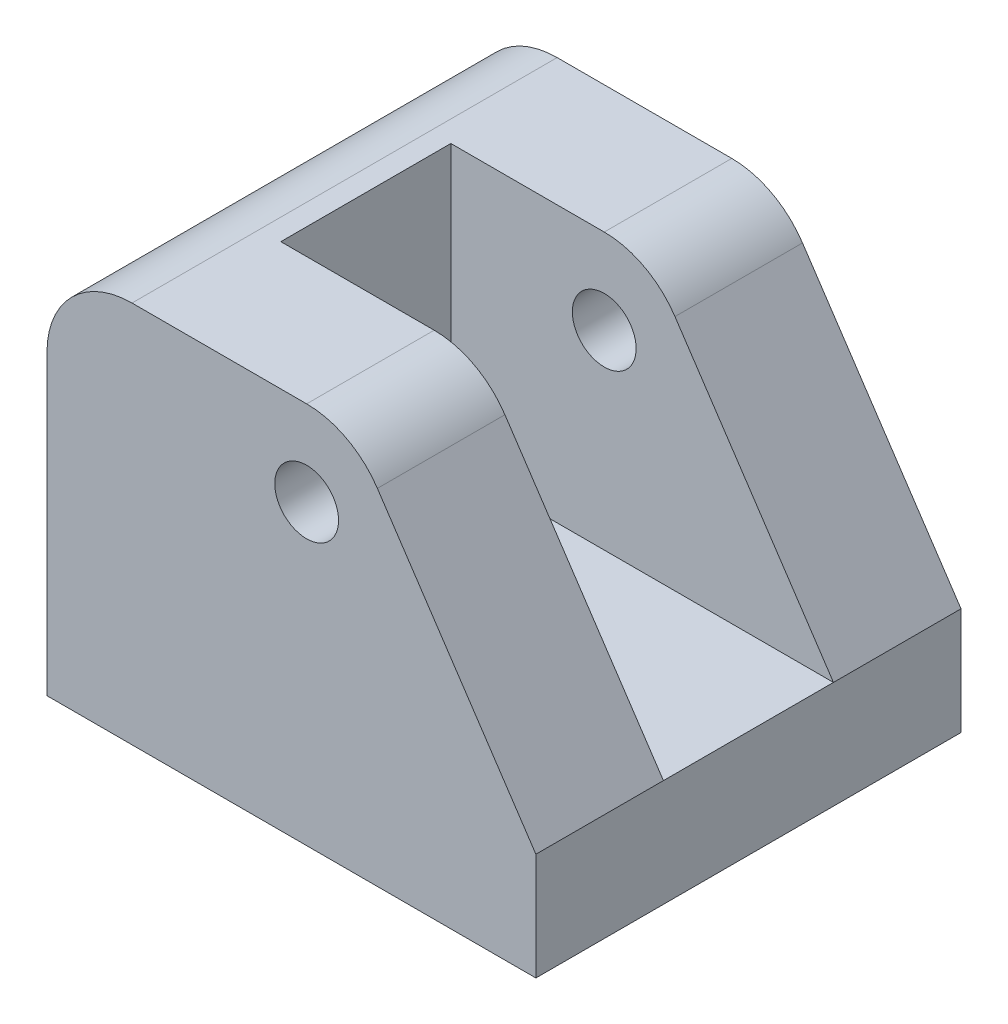
ISO-10303-21;
HEADER;
FILE_DESCRIPTION(('STEP AP214'),'2;1');
FILE_NAME('part.step','',(''),(''),'','','');
FILE_SCHEMA(('AUTOMOTIVE_DESIGN { 1 0 10303 214 1 1 1 1 }'));
ENDSEC;
DATA;
#1=APPLICATION_CONTEXT('core data for automotive mechanical design processes');
#2=APPLICATION_PROTOCOL_DEFINITION('international standard','automotive_design',2000,#1);
#3=PRODUCT_CONTEXT('',#1,'mechanical');
#4=PRODUCT('Part','Part','',(#3));
#5=PRODUCT_RELATED_PRODUCT_CATEGORY('part','',(#4));
#6=PRODUCT_DEFINITION_FORMATION('','',#4);
#7=PRODUCT_DEFINITION_CONTEXT('part definition',#1,'design');
#8=PRODUCT_DEFINITION('design','',#6,#7);
#9=PRODUCT_DEFINITION_SHAPE('','',#8);
#10=(LENGTH_UNIT() NAMED_UNIT(*) SI_UNIT(.MILLI.,.METRE.));
#11=(NAMED_UNIT(*) PLANE_ANGLE_UNIT() SI_UNIT($,.RADIAN.));
#12=(NAMED_UNIT(*) SI_UNIT($,.STERADIAN.) SOLID_ANGLE_UNIT());
#13=UNCERTAINTY_MEASURE_WITH_UNIT(LENGTH_MEASURE(1.E-05),#10,'distance_accuracy_value','');
#14=(GEOMETRIC_REPRESENTATION_CONTEXT(3) GLOBAL_UNCERTAINTY_ASSIGNED_CONTEXT((#13)) GLOBAL_UNIT_ASSIGNED_CONTEXT((#10,
#11,#12)) REPRESENTATION_CONTEXT('',''));
#15=CARTESIAN_POINT('',(0.,0.,0.));
#16=DIRECTION('',(0.,0.,1.));
#17=DIRECTION('',(1.,0.,0.));
#18=AXIS2_PLACEMENT_3D('',#15,#16,#17);
#19=CARTESIAN_POINT('',(100.422581046956,180.,-36.791008543361));
#20=DIRECTION('',(-0.831873688632426,-0.554965013456778,0.));
#21=DIRECTION('',(0.554965013456778,-0.831873688632426,0.));
#22=AXIS2_PLACEMENT_3D('',#19,#20,#21);
#23=PLANE('',#22);
#24=DIRECTION('',(0.,0.,1.));
#25=VECTOR('',#24,1.);
#26=CARTESIAN_POINT('',(186.865714121577,50.4246822339033,-36.791008543361));
#27=LINE('',#26,#25);
#28=CARTESIAN_POINT('',(186.865714121577,50.4246822339033,103.208991456639));
#29=VERTEX_POINT('',#28);
#30=CARTESIAN_POINT('',(186.865714121577,50.4246822339033,163.208991456639));
#31=VERTEX_POINT('',#30);
#32=EDGE_CURVE('E171',#29,#31,#27,.T.);
#33=ORIENTED_EDGE('',*,*,#32,.F.);
#34=DIRECTION('',(-0.554965013456778,0.831873688632426,0.));
#35=VECTOR('',#34,1.);
#36=CARTESIAN_POINT('',(100.422581046956,180.,103.208991456639));
#37=LINE('',#36,#35);
#38=CARTESIAN_POINT('',(112.298367030846,162.198600538271,103.208991456639));
#39=VERTEX_POINT('',#38);
#40=EDGE_CURVE('E127',#29,#39,#37,.T.);
#41=ORIENTED_EDGE('',*,*,#40,.T.);
#42=DIRECTION('',(0.,0.,1.));
#43=VECTOR('',#42,1.);
#44=CARTESIAN_POINT('',(112.298367030846,162.198600538271,-36.791008543361));
#45=LINE('',#44,#43);
#46=CARTESIAN_POINT('',(112.298367030846,162.198600538271,163.208991456639));
#47=VERTEX_POINT('',#46);
#48=EDGE_CURVE('E203',#39,#47,#45,.T.);
#49=ORIENTED_EDGE('',*,*,#48,.T.);
#50=DIRECTION('',(0.554965013456778,-0.831873688632426,0.));
#51=VECTOR('',#50,1.);
#52=CARTESIAN_POINT('',(100.422581046956,180.,163.208991456639));
#53=LINE('',#52,#51);
#54=EDGE_CURVE('E166',#47,#31,#53,.T.);
#55=ORIENTED_EDGE('',*,*,#54,.T.);
#56=EDGE_LOOP('',(#33,#41,#49,#55));
#57=FACE_BOUND('',#56,.T.);
#58=ADVANCED_FACE('F31',(#57),#23,.F.);
#59=CARTESIAN_POINT('',(79.0234194855493,140.,-36.791008543361));
#60=DIRECTION('',(0.,0.,1.));
#61=DIRECTION('',(1.,0.,0.));
#62=AXIS2_PLACEMENT_3D('',#59,#60,#61);
#63=CYLINDRICAL_SURFACE('',#62,40.);
#64=CARTESIAN_POINT('',(79.0234194855493,140.,103.208991456639));
#65=DIRECTION('',(0.,0.,1.));
#66=DIRECTION('',(1.,0.,0.));
#67=AXIS2_PLACEMENT_3D('',#64,#65,#66);
#68=CIRCLE('',#67,40.);
#69=CARTESIAN_POINT('',(79.0234194855493,180.,103.208991456639));
#70=VERTEX_POINT('',#69);
#71=EDGE_CURVE('E11',#70,#39,#68,.F.);
#72=ORIENTED_EDGE('',*,*,#71,.F.);
#73=DIRECTION('',(0.,0.,1.));
#74=VECTOR('',#73,1.);
#75=CARTESIAN_POINT('',(79.0234194855493,180.,-36.7910085433611));
#76=LINE('',#75,#74);
#77=CARTESIAN_POINT('',(79.0234194855493,180.,163.208991456639));
#78=VERTEX_POINT('',#77);
#79=EDGE_CURVE('E215',#78,#70,#76,.F.);
#80=ORIENTED_EDGE('',*,*,#79,.F.);
#81=CARTESIAN_POINT('',(79.0234194855493,140.,163.208991456639));
#82=DIRECTION('',(0.,0.,-1.));
#83=DIRECTION('',(-1.,0.,0.));
#84=AXIS2_PLACEMENT_3D('',#81,#82,#83);
#85=CIRCLE('',#84,40.);
#86=EDGE_CURVE('E209',#47,#78,#85,.F.);
#87=ORIENTED_EDGE('',*,*,#86,.F.);
#88=ORIENTED_EDGE('',*,*,#48,.F.);
#89=EDGE_LOOP('',(#72,#80,#87,#88));
#90=FACE_BOUND('',#89,.T.);
#91=ADVANCED_FACE('F262',(#90),#63,.T.);
#92=CARTESIAN_POINT('',(-43.1342858784233,180.,163.208991456639));
#93=DIRECTION('',(1.,0.,0.));
#94=DIRECTION('',(0.,0.,-1.));
#95=AXIS2_PLACEMENT_3D('',#92,#93,#94);
#96=PLANE('',#95);
#97=DIRECTION('',(0.,-1.,0.));
#98=VECTOR('',#97,1.);
#99=CARTESIAN_POINT('',(-43.1342858784233,180.,163.208991456639));
#100=LINE('',#99,#98);
#101=CARTESIAN_POINT('',(-43.1342858784233,140.,163.208991456639));
#102=VERTEX_POINT('',#101);
#103=CARTESIAN_POINT('',(-43.1342858784233,0.,163.208991456639));
#104=VERTEX_POINT('',#103);
#105=EDGE_CURVE('E201',#102,#104,#100,.T.);
#106=ORIENTED_EDGE('',*,*,#105,.F.);
#107=DIRECTION('',(0.,0.,1.));
#108=VECTOR('',#107,1.);
#109=CARTESIAN_POINT('',(-43.1342858784233,140.,163.208991456639));
#110=LINE('',#109,#108);
#111=CARTESIAN_POINT('',(-43.1342858784233,140.,-36.7910085433611));
#112=VERTEX_POINT('',#111);
#113=EDGE_CURVE('E55',#102,#112,#110,.F.);
#114=ORIENTED_EDGE('',*,*,#113,.T.);
#115=DIRECTION('',(0.,-1.,0.));
#116=VECTOR('',#115,1.);
#117=CARTESIAN_POINT('',(-43.1342858784233,180.,-36.7910085433611));
#118=LINE('',#117,#116);
#119=CARTESIAN_POINT('',(-43.1342858784233,0.,-36.7910085433611));
#120=VERTEX_POINT('',#119);
#121=EDGE_CURVE('E185',#112,#120,#118,.T.);
#122=ORIENTED_EDGE('',*,*,#121,.T.);
#123=DIRECTION('',(0.,0.,1.));
#124=VECTOR('',#123,1.);
#125=CARTESIAN_POINT('',(-43.1342858784233,0.,163.208991456639));
#126=LINE('',#125,#124);
#127=EDGE_CURVE('E177',#120,#104,#126,.T.);
#128=ORIENTED_EDGE('',*,*,#127,.T.);
#129=EDGE_LOOP('',(#106,#114,#122,#128));
#130=FACE_BOUND('',#129,.T.);
#131=ADVANCED_FACE('F249',(#130),#96,.F.);
#132=CARTESIAN_POINT('',(-43.1342858784233,180.,163.208991456639));
#133=DIRECTION('',(0.,0.,-1.));
#134=DIRECTION('',(-1.,0.,0.));
#135=AXIS2_PLACEMENT_3D('',#132,#133,#134);
#136=PLANE('',#135);
#137=CARTESIAN_POINT('',(79.0234194855493,140.,163.208991456639));
#138=DIRECTION('',(0.,0.,1.));
#139=DIRECTION('',(1.,0.,0.));
#140=AXIS2_PLACEMENT_3D('',#137,#138,#139);
#141=CIRCLE('',#140,15.);
#142=CARTESIAN_POINT('',(94.0234194855493,140.,163.208991456639));
#143=VERTEX_POINT('',#142);
#144=EDGE_CURVE('E427',#143,#143,#141,.T.);
#145=ORIENTED_EDGE('',*,*,#144,.F.);
#146=EDGE_LOOP('',(#145));
#147=FACE_BOUND('',#146,.T.);
#148=ORIENTED_EDGE('',*,*,#54,.F.);
#149=ORIENTED_EDGE('',*,*,#86,.T.);
#150=DIRECTION('',(1.,0.,0.));
#151=VECTOR('',#150,1.);
#152=CARTESIAN_POINT('',(-43.1342858784233,180.,163.208991456639));
#153=LINE('',#152,#151);
#154=CARTESIAN_POINT('',(-3.13428587842333,180.,163.208991456639));
#155=VERTEX_POINT('',#154);
#156=EDGE_CURVE('E178',#155,#78,#153,.T.);
#157=ORIENTED_EDGE('',*,*,#156,.F.);
#158=CARTESIAN_POINT('',(-3.13428587842333,140.,163.208991456639));
#159=DIRECTION('',(0.,0.,-1.));
#160=DIRECTION('',(-1.,0.,0.));
#161=AXIS2_PLACEMENT_3D('',#158,#159,#160);
#162=CIRCLE('',#161,40.);
#163=EDGE_CURVE('E207',#155,#102,#162,.F.);
#164=ORIENTED_EDGE('',*,*,#163,.T.);
#165=ORIENTED_EDGE('',*,*,#105,.T.);
#166=DIRECTION('',(1.,0.,0.));
#167=VECTOR('',#166,1.);
#168=CARTESIAN_POINT('',(-43.1342858784233,0.,163.208991456639));
#169=LINE('',#168,#167);
#170=CARTESIAN_POINT('',(186.865714121577,0.,163.208991456639));
#171=VERTEX_POINT('',#170);
#172=EDGE_CURVE('E188',#104,#171,#169,.T.);
#173=ORIENTED_EDGE('',*,*,#172,.T.);
#174=DIRECTION('',(0.,-1.,0.));
#175=VECTOR('',#174,1.);
#176=CARTESIAN_POINT('',(186.865714121577,180.,163.208991456639));
#177=LINE('',#176,#175);
#178=EDGE_CURVE('E199',#31,#171,#177,.T.);
#179=ORIENTED_EDGE('',*,*,#178,.F.);
#180=EDGE_LOOP('',(#148,#149,#157,#164,#165,#173,#179));
#181=FACE_BOUND('',#180,.T.);
#182=ADVANCED_FACE('F256',(#147,#181),#136,.F.);
#183=CARTESIAN_POINT('',(186.865714121577,180.,163.208991456639));
#184=DIRECTION('',(-1.,0.,0.));
#185=DIRECTION('',(0.,0.,1.));
#186=AXIS2_PLACEMENT_3D('',#183,#184,#185);
#187=PLANE('',#186);
#188=DIRECTION('',(0.,-1.,0.));
#189=VECTOR('',#188,1.);
#190=CARTESIAN_POINT('',(186.865714121577,180.,-36.7910085433611));
#191=LINE('',#190,#189);
#192=CARTESIAN_POINT('',(186.865714121577,50.4246822339033,-36.791008543361));
#193=VERTEX_POINT('',#192);
#194=CARTESIAN_POINT('',(186.865714121577,0.,-36.7910085433611));
#195=VERTEX_POINT('',#194);
#196=EDGE_CURVE('E197',#193,#195,#191,.T.);
#197=ORIENTED_EDGE('',*,*,#196,.F.);
#198=CARTESIAN_POINT('',(186.865714121577,50.4246822339033,23.208991456639));
#199=VERTEX_POINT('',#198);
#200=EDGE_CURVE('E174',#193,#199,#27,.T.);
#201=ORIENTED_EDGE('',*,*,#200,.T.);
#202=DIRECTION('',(0.,0.,-1.));
#203=VECTOR('',#202,1.);
#204=CARTESIAN_POINT('',(186.865714121577,50.4246822339033,103.208991456639));
#205=LINE('',#204,#203);
#206=EDGE_CURVE('E145',#29,#199,#205,.T.);
#207=ORIENTED_EDGE('',*,*,#206,.F.);
#208=ORIENTED_EDGE('',*,*,#32,.T.);
#209=ORIENTED_EDGE('',*,*,#178,.T.);
#210=DIRECTION('',(0.,0.,-1.));
#211=VECTOR('',#210,1.);
#212=CARTESIAN_POINT('',(186.865714121577,0.,163.208991456639));
#213=LINE('',#212,#211);
#214=EDGE_CURVE('E191',#171,#195,#213,.T.);
#215=ORIENTED_EDGE('',*,*,#214,.T.);
#216=EDGE_LOOP('',(#197,#201,#207,#208,#209,#215));
#217=FACE_BOUND('',#216,.T.);
#218=ADVANCED_FACE('F241',(#217),#187,.F.);
#219=CARTESIAN_POINT('',(-43.1342858784233,180.,-36.7910085433611));
#220=DIRECTION('',(0.,0.,1.));
#221=DIRECTION('',(1.,0.,0.));
#222=AXIS2_PLACEMENT_3D('',#219,#220,#221);
#223=PLANE('',#222);
#224=CARTESIAN_POINT('',(79.0234194855493,140.,-36.791008543361));
#225=DIRECTION('',(0.,0.,1.));
#226=DIRECTION('',(1.,0.,0.));
#227=AXIS2_PLACEMENT_3D('',#224,#225,#226);
#228=CIRCLE('',#227,15.);
#229=CARTESIAN_POINT('',(94.0234194855493,140.,-36.791008543361));
#230=VERTEX_POINT('',#229);
#231=EDGE_CURVE('E424',#230,#230,#228,.T.);
#232=ORIENTED_EDGE('',*,*,#231,.T.);
#233=EDGE_LOOP('',(#232));
#234=FACE_BOUND('',#233,.T.);
#235=DIRECTION('',(-1.,0.,0.));
#236=VECTOR('',#235,1.);
#237=CARTESIAN_POINT('',(-43.1342858784233,180.,-36.7910085433611));
#238=LINE('',#237,#236);
#239=CARTESIAN_POINT('',(79.0234194855493,180.,-36.7910085433611));
#240=VERTEX_POINT('',#239);
#241=CARTESIAN_POINT('',(-3.13428587842333,180.,-36.7910085433611));
#242=VERTEX_POINT('',#241);
#243=EDGE_CURVE('E181',#240,#242,#238,.T.);
#244=ORIENTED_EDGE('',*,*,#243,.F.);
#245=CARTESIAN_POINT('',(79.0234194855493,140.,-36.7910085433611));
#246=DIRECTION('',(0.,0.,1.));
#247=DIRECTION('',(1.,0.,0.));
#248=AXIS2_PLACEMENT_3D('',#245,#246,#247);
#249=CIRCLE('',#248,40.);
#250=CARTESIAN_POINT('',(112.298367030846,162.198600538271,-36.791008543361));
#251=VERTEX_POINT('',#250);
#252=EDGE_CURVE('E220',#240,#251,#249,.F.);
#253=ORIENTED_EDGE('',*,*,#252,.T.);
#254=DIRECTION('',(0.554965013456778,-0.831873688632426,0.));
#255=VECTOR('',#254,1.);
#256=CARTESIAN_POINT('',(100.422581046956,180.,-36.791008543361));
#257=LINE('',#256,#255);
#258=EDGE_CURVE('E169',#251,#193,#257,.T.);
#259=ORIENTED_EDGE('',*,*,#258,.T.);
#260=ORIENTED_EDGE('',*,*,#196,.T.);
#261=DIRECTION('',(-1.,0.,0.));
#262=VECTOR('',#261,1.);
#263=CARTESIAN_POINT('',(-43.1342858784233,0.,-36.7910085433611));
#264=LINE('',#263,#262);
#265=EDGE_CURVE('E182',#195,#120,#264,.T.);
#266=ORIENTED_EDGE('',*,*,#265,.T.);
#267=ORIENTED_EDGE('',*,*,#121,.F.);
#268=CARTESIAN_POINT('',(-3.13428587842333,140.,-36.7910085433611));
#269=DIRECTION('',(0.,0.,1.));
#270=DIRECTION('',(1.,0.,0.));
#271=AXIS2_PLACEMENT_3D('',#268,#269,#270);
#272=CIRCLE('',#271,40.);
#273=EDGE_CURVE('E218',#112,#242,#272,.F.);
#274=ORIENTED_EDGE('',*,*,#273,.T.);
#275=EDGE_LOOP('',(#244,#253,#259,#260,#266,#267,#274));
#276=FACE_BOUND('',#275,.T.);
#277=ADVANCED_FACE('F234',(#234,#276),#223,.F.);
#278=CARTESIAN_POINT('',(-43.1342858784233,180.,-36.7910085433611));
#279=DIRECTION('',(0.,-1.,0.));
#280=DIRECTION('',(0.,0.,-1.));
#281=AXIS2_PLACEMENT_3D('',#278,#279,#280);
#282=PLANE('',#281);
#283=ORIENTED_EDGE('',*,*,#79,.T.);
#284=DIRECTION('',(1.,0.,0.));
#285=VECTOR('',#284,1.);
#286=CARTESIAN_POINT('',(6.86571412157669,180.,103.208991456639));
#287=LINE('',#286,#285);
#288=CARTESIAN_POINT('',(6.86571412157669,180.,103.208991456639));
#289=VERTEX_POINT('',#288);
#290=EDGE_CURVE('E154',#289,#70,#287,.T.);
#291=ORIENTED_EDGE('',*,*,#290,.F.);
#292=DIRECTION('',(0.,0.,1.));
#293=VECTOR('',#292,1.);
#294=CARTESIAN_POINT('',(6.86571412157669,180.,103.208991456639));
#295=LINE('',#294,#293);
#296=CARTESIAN_POINT('',(6.86571412157669,180.,23.208991456639));
#297=VERTEX_POINT('',#296);
#298=EDGE_CURVE('E132',#297,#289,#295,.T.);
#299=ORIENTED_EDGE('',*,*,#298,.F.);
#300=DIRECTION('',(1.,0.,0.));
#301=VECTOR('',#300,1.);
#302=CARTESIAN_POINT('',(6.86571412157669,180.,23.208991456639));
#303=LINE('',#302,#301);
#304=CARTESIAN_POINT('',(79.0234194855493,180.,23.208991456639));
#305=VERTEX_POINT('',#304);
#306=EDGE_CURVE('E156',#297,#305,#303,.T.);
#307=ORIENTED_EDGE('',*,*,#306,.T.);
#308=EDGE_CURVE('E214',#305,#240,#76,.F.);
#309=ORIENTED_EDGE('',*,*,#308,.T.);
#310=ORIENTED_EDGE('',*,*,#243,.T.);
#311=DIRECTION('',(0.,0.,1.));
#312=VECTOR('',#311,1.);
#313=CARTESIAN_POINT('',(-3.13428587842333,180.,-36.7910085433611));
#314=LINE('',#313,#312);
#315=EDGE_CURVE('E211',#242,#155,#314,.T.);
#316=ORIENTED_EDGE('',*,*,#315,.T.);
#317=ORIENTED_EDGE('',*,*,#156,.T.);
#318=EDGE_LOOP('',(#283,#291,#299,#307,#309,#310,#316,#317));
#319=FACE_BOUND('',#318,.T.);
#320=ADVANCED_FACE('F228',(#319),#282,.F.);
#321=CARTESIAN_POINT('',(-43.1342858784233,0.,-36.7910085433611));
#322=DIRECTION('',(0.,-1.,0.));
#323=DIRECTION('',(0.,0.,-1.));
#324=AXIS2_PLACEMENT_3D('',#321,#322,#323);
#325=PLANE('',#324);
#326=CARTESIAN_POINT('',(71.8657141215767,0.,63.208991456639));
#327=DIRECTION('',(0.,-1.,0.));
#328=DIRECTION('',(0.,0.,-1.));
#329=AXIS2_PLACEMENT_3D('',#326,#327,#328);
#330=CIRCLE('',#329,30.);
#331=CARTESIAN_POINT('',(71.8657141215767,0.,33.208991456639));
#332=VERTEX_POINT('',#331);
#333=EDGE_CURVE('E162',#332,#332,#330,.T.);
#334=ORIENTED_EDGE('',*,*,#333,.F.);
#335=EDGE_LOOP('',(#334));
#336=FACE_BOUND('',#335,.T.);
#337=ORIENTED_EDGE('',*,*,#127,.F.);
#338=ORIENTED_EDGE('',*,*,#265,.F.);
#339=ORIENTED_EDGE('',*,*,#214,.F.);
#340=ORIENTED_EDGE('',*,*,#172,.F.);
#341=EDGE_LOOP('',(#337,#338,#339,#340));
#342=FACE_BOUND('',#341,.T.);
#343=ADVANCED_FACE('F248',(#336,#342),#325,.T.);
#344=CARTESIAN_POINT('',(112.298367030846,162.198600538271,23.208991456639));
#345=VERTEX_POINT('',#344);
#346=EDGE_CURVE('E204',#251,#345,#45,.T.);
#347=ORIENTED_EDGE('',*,*,#346,.T.);
#348=DIRECTION('',(0.554965013456778,-0.831873688632426,0.));
#349=VECTOR('',#348,1.);
#350=CARTESIAN_POINT('',(100.422581046956,180.,23.208991456639));
#351=LINE('',#350,#349);
#352=EDGE_CURVE('E47',#345,#199,#351,.T.);
#353=ORIENTED_EDGE('',*,*,#352,.T.);
#354=ORIENTED_EDGE('',*,*,#200,.F.);
#355=ORIENTED_EDGE('',*,*,#258,.F.);
#356=EDGE_LOOP('',(#347,#353,#354,#355));
#357=FACE_BOUND('',#356,.T.);
#358=ADVANCED_FACE('F237',(#357),#23,.F.);
#359=CARTESIAN_POINT('',(79.0234194855493,140.,23.208991456639));
#360=DIRECTION('',(0.,0.,-1.));
#361=DIRECTION('',(-1.,0.,0.));
#362=AXIS2_PLACEMENT_3D('',#359,#360,#361);
#363=CIRCLE('',#362,40.);
#364=EDGE_CURVE('E40',#345,#305,#363,.F.);
#365=ORIENTED_EDGE('',*,*,#364,.F.);
#366=ORIENTED_EDGE('',*,*,#346,.F.);
#367=ORIENTED_EDGE('',*,*,#252,.F.);
#368=ORIENTED_EDGE('',*,*,#308,.F.);
#369=EDGE_LOOP('',(#365,#366,#367,#368));
#370=FACE_BOUND('',#369,.T.);
#371=ADVANCED_FACE('F231',(#370),#63,.T.);
#372=CARTESIAN_POINT('',(-3.13428587842333,140.,-36.7910085433611));
#373=DIRECTION('',(0.,0.,1.));
#374=DIRECTION('',(1.,0.,0.));
#375=AXIS2_PLACEMENT_3D('',#372,#373,#374);
#376=CYLINDRICAL_SURFACE('',#375,40.);
#377=ORIENTED_EDGE('',*,*,#273,.F.);
#378=ORIENTED_EDGE('',*,*,#113,.F.);
#379=ORIENTED_EDGE('',*,*,#163,.F.);
#380=ORIENTED_EDGE('',*,*,#315,.F.);
#381=EDGE_LOOP('',(#377,#378,#379,#380));
#382=FACE_BOUND('',#381,.T.);
#383=ADVANCED_FACE('F33',(#382),#376,.T.);
#384=CARTESIAN_POINT('',(71.8657141215767,48.,63.208991456639));
#385=DIRECTION('',(0.,-1.,0.));
#386=DIRECTION('',(0.,0.,-1.));
#387=AXIS2_PLACEMENT_3D('',#384,#385,#386);
#388=CYLINDRICAL_SURFACE('',#387,30.);
#389=CARTESIAN_POINT('',(71.8657141215767,48.,63.208991456639));
#390=DIRECTION('',(0.,-1.,0.));
#391=DIRECTION('',(0.,0.,-1.));
#392=AXIS2_PLACEMENT_3D('',#389,#390,#391);
#393=CIRCLE('',#392,30.);
#394=CARTESIAN_POINT('',(71.8657141215767,48.,33.208991456639));
#395=VERTEX_POINT('',#394);
#396=EDGE_CURVE('E163',#395,#395,#393,.T.);
#397=ORIENTED_EDGE('',*,*,#396,.F.);
#398=EDGE_LOOP('',(#397));
#399=FACE_BOUND('',#398,.T.);
#400=ORIENTED_EDGE('',*,*,#333,.T.);
#401=EDGE_LOOP('',(#400));
#402=FACE_BOUND('',#401,.T.);
#403=ADVANCED_FACE('F379',(#399,#402),#388,.F.);
#404=CARTESIAN_POINT('',(71.8657141215767,48.,63.208991456639));
#405=DIRECTION('',(0.,-1.,0.));
#406=DIRECTION('',(0.,0.,-1.));
#407=AXIS2_PLACEMENT_3D('',#404,#405,#406);
#408=PLANE('',#407);
#409=ORIENTED_EDGE('',*,*,#396,.T.);
#410=EDGE_LOOP('',(#409));
#411=FACE_BOUND('',#410,.T.);
#412=ADVANCED_FACE('F376',(#411),#408,.T.);
#413=CARTESIAN_POINT('',(6.86571412157669,180.,103.208991456639));
#414=DIRECTION('',(0.,0.,1.));
#415=DIRECTION('',(1.,0.,0.));
#416=AXIS2_PLACEMENT_3D('',#413,#414,#415);
#417=PLANE('',#416);
#418=CARTESIAN_POINT('',(79.0234194855493,140.,103.208991456639));
#419=DIRECTION('',(0.,0.,1.));
#420=DIRECTION('',(1.,0.,0.));
#421=AXIS2_PLACEMENT_3D('',#418,#419,#420);
#422=CIRCLE('',#421,15.);
#423=CARTESIAN_POINT('',(94.0234194855493,140.,103.208991456639));
#424=VERTEX_POINT('',#423);
#425=EDGE_CURVE('E147',#424,#424,#422,.T.);
#426=ORIENTED_EDGE('',*,*,#425,.T.);
#427=EDGE_LOOP('',(#426));
#428=FACE_BOUND('',#427,.T.);
#429=DIRECTION('',(1.,0.,0.));
#430=VECTOR('',#429,1.);
#431=CARTESIAN_POINT('',(6.86571412157669,50.4246822339033,103.208991456639));
#432=LINE('',#431,#430);
#433=CARTESIAN_POINT('',(6.86571412157669,50.4246822339033,103.208991456639));
#434=VERTEX_POINT('',#433);
#435=EDGE_CURVE('E120',#434,#29,#432,.T.);
#436=ORIENTED_EDGE('',*,*,#435,.F.);
#437=DIRECTION('',(0.,-1.,0.));
#438=VECTOR('',#437,1.);
#439=CARTESIAN_POINT('',(6.86571412157669,180.,103.208991456639));
#440=LINE('',#439,#438);
#441=EDGE_CURVE('E124',#289,#434,#440,.T.);
#442=ORIENTED_EDGE('',*,*,#441,.F.);
#443=ORIENTED_EDGE('',*,*,#290,.T.);
#444=ORIENTED_EDGE('',*,*,#71,.T.);
#445=ORIENTED_EDGE('',*,*,#40,.F.);
#446=EDGE_LOOP('',(#436,#442,#443,#444,#445));
#447=FACE_BOUND('',#446,.T.);
#448=ADVANCED_FACE('F122',(#428,#447),#417,.F.);
#449=CARTESIAN_POINT('',(6.86571412157669,180.,23.208991456639));
#450=DIRECTION('',(0.,0.,-1.));
#451=DIRECTION('',(-1.,0.,0.));
#452=AXIS2_PLACEMENT_3D('',#449,#450,#451);
#453=PLANE('',#452);
#454=CARTESIAN_POINT('',(79.0234194855493,140.,23.208991456639));
#455=DIRECTION('',(0.,0.,-1.));
#456=DIRECTION('',(-1.,0.,0.));
#457=AXIS2_PLACEMENT_3D('',#454,#455,#456);
#458=CIRCLE('',#457,15.);
#459=CARTESIAN_POINT('',(64.0234194855493,140.,23.208991456639));
#460=VERTEX_POINT('',#459);
#461=EDGE_CURVE('E35',#460,#460,#458,.T.);
#462=ORIENTED_EDGE('',*,*,#461,.T.);
#463=EDGE_LOOP('',(#462));
#464=FACE_BOUND('',#463,.T.);
#465=ORIENTED_EDGE('',*,*,#364,.T.);
#466=ORIENTED_EDGE('',*,*,#306,.F.);
#467=DIRECTION('',(0.,1.,0.));
#468=VECTOR('',#467,1.);
#469=CARTESIAN_POINT('',(6.86571412157669,180.,23.208991456639));
#470=LINE('',#469,#468);
#471=CARTESIAN_POINT('',(6.86571412157669,50.4246822339033,23.208991456639));
#472=VERTEX_POINT('',#471);
#473=EDGE_CURVE('E140',#472,#297,#470,.T.);
#474=ORIENTED_EDGE('',*,*,#473,.F.);
#475=DIRECTION('',(1.,0.,0.));
#476=VECTOR('',#475,1.);
#477=CARTESIAN_POINT('',(6.86571412157669,50.4246822339033,23.208991456639));
#478=LINE('',#477,#476);
#479=EDGE_CURVE('E131',#472,#199,#478,.T.);
#480=ORIENTED_EDGE('',*,*,#479,.T.);
#481=ORIENTED_EDGE('',*,*,#352,.F.);
#482=EDGE_LOOP('',(#465,#466,#474,#480,#481));
#483=FACE_BOUND('',#482,.T.);
#484=ADVANCED_FACE('F223',(#464,#483),#453,.F.);
#485=CARTESIAN_POINT('',(6.86571412157669,50.4246822339033,103.208991456639));
#486=DIRECTION('',(0.,-1.,0.));
#487=DIRECTION('',(0.,0.,-1.));
#488=AXIS2_PLACEMENT_3D('',#485,#486,#487);
#489=PLANE('',#488);
#490=ORIENTED_EDGE('',*,*,#206,.T.);
#491=ORIENTED_EDGE('',*,*,#479,.F.);
#492=DIRECTION('',(0.,0.,-1.));
#493=VECTOR('',#492,1.);
#494=CARTESIAN_POINT('',(6.86571412157669,50.4246822339033,103.208991456639));
#495=LINE('',#494,#493);
#496=EDGE_CURVE('E135',#434,#472,#495,.T.);
#497=ORIENTED_EDGE('',*,*,#496,.F.);
#498=ORIENTED_EDGE('',*,*,#435,.T.);
#499=EDGE_LOOP('',(#490,#491,#497,#498));
#500=FACE_BOUND('',#499,.T.);
#501=ADVANCED_FACE('F136',(#500),#489,.F.);
#502=CARTESIAN_POINT('',(6.86571412157669,50.4246822339033,103.208991456639));
#503=DIRECTION('',(1.,0.,0.));
#504=DIRECTION('',(0.,0.,-1.));
#505=AXIS2_PLACEMENT_3D('',#502,#503,#504);
#506=PLANE('',#505);
#507=ORIENTED_EDGE('',*,*,#441,.T.);
#508=ORIENTED_EDGE('',*,*,#496,.T.);
#509=ORIENTED_EDGE('',*,*,#473,.T.);
#510=ORIENTED_EDGE('',*,*,#298,.T.);
#511=EDGE_LOOP('',(#507,#508,#509,#510));
#512=FACE_BOUND('',#511,.T.);
#513=ADVANCED_FACE('F142',(#512),#506,.T.);
#514=CARTESIAN_POINT('',(79.0234194855493,140.,-36.791008543361));
#515=DIRECTION('',(0.,0.,1.));
#516=DIRECTION('',(1.,0.,0.));
#517=AXIS2_PLACEMENT_3D('',#514,#515,#516);
#518=CYLINDRICAL_SURFACE('',#517,15.);
#519=ORIENTED_EDGE('',*,*,#231,.F.);
#520=EDGE_LOOP('',(#519));
#521=FACE_BOUND('',#520,.T.);
#522=ORIENTED_EDGE('',*,*,#461,.F.);
#523=EDGE_LOOP('',(#522));
#524=FACE_BOUND('',#523,.T.);
#525=ADVANCED_FACE('F345',(#521,#524),#518,.F.);
#526=ORIENTED_EDGE('',*,*,#144,.T.);
#527=EDGE_LOOP('',(#526));
#528=FACE_BOUND('',#527,.T.);
#529=ORIENTED_EDGE('',*,*,#425,.F.);
#530=EDGE_LOOP('',(#529));
#531=FACE_BOUND('',#530,.T.);
#532=ADVANCED_FACE('F355',(#528,#531),#518,.F.);
#533=CLOSED_SHELL('',(#58,#91,#131,#182,#218,#277,#320,#343,#358,#371,#383,#403,#412,#448,#484,
#501,#513,#525,#532));
#534=MANIFOLD_SOLID_BREP('B2',#533);
#535=ADVANCED_BREP_SHAPE_REPRESENTATION('',(#18,#534),#14);
#536=SHAPE_DEFINITION_REPRESENTATION(#9,#535);
ENDSEC;
END-ISO-10303-21;
